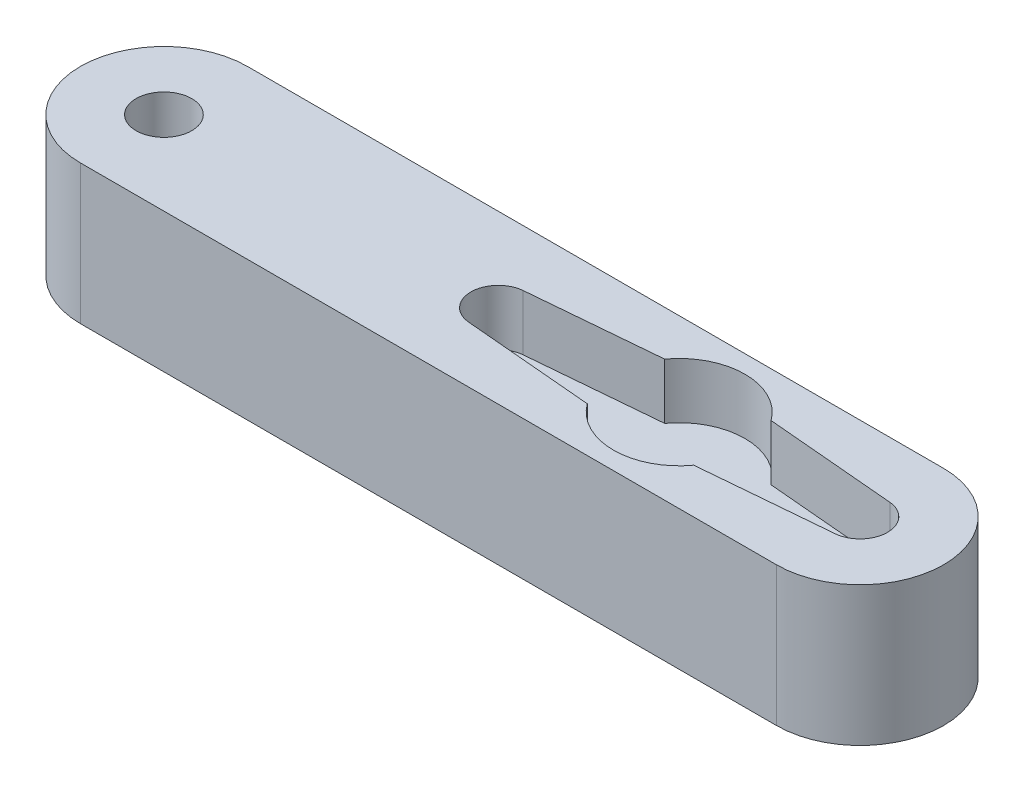
ISO-10303-21;
HEADER;
FILE_DESCRIPTION(('STEP AP214'),'2;1');
FILE_NAME('part.step','',(''),(''),'','','');
FILE_SCHEMA(('AUTOMOTIVE_DESIGN { 1 0 10303 214 1 1 1 1 }'));
ENDSEC;
DATA;
#1=APPLICATION_CONTEXT('core data for automotive mechanical design processes');
#2=APPLICATION_PROTOCOL_DEFINITION('international standard','automotive_design',2000,#1);
#3=PRODUCT_CONTEXT('',#1,'mechanical');
#4=PRODUCT('Part','Part','',(#3));
#5=PRODUCT_RELATED_PRODUCT_CATEGORY('part','',(#4));
#6=PRODUCT_DEFINITION_FORMATION('','',#4);
#7=PRODUCT_DEFINITION_CONTEXT('part definition',#1,'design');
#8=PRODUCT_DEFINITION('design','',#6,#7);
#9=PRODUCT_DEFINITION_SHAPE('','',#8);
#10=(LENGTH_UNIT() NAMED_UNIT(*) SI_UNIT(.MILLI.,.METRE.));
#11=(NAMED_UNIT(*) PLANE_ANGLE_UNIT() SI_UNIT($,.RADIAN.));
#12=(NAMED_UNIT(*) SI_UNIT($,.STERADIAN.) SOLID_ANGLE_UNIT());
#13=UNCERTAINTY_MEASURE_WITH_UNIT(LENGTH_MEASURE(1.E-05),#10,'distance_accuracy_value','');
#14=(GEOMETRIC_REPRESENTATION_CONTEXT(3) GLOBAL_UNCERTAINTY_ASSIGNED_CONTEXT((#13)) GLOBAL_UNIT_ASSIGNED_CONTEXT((#10,
#11,#12)) REPRESENTATION_CONTEXT('',''));
#15=CARTESIAN_POINT('',(0.,0.,0.));
#16=DIRECTION('',(0.,0.,1.));
#17=DIRECTION('',(1.,0.,0.));
#18=AXIS2_PLACEMENT_3D('',#15,#16,#17);
#19=CARTESIAN_POINT('',(-31.75,12.7,0.));
#20=DIRECTION('',(0.,1.,0.));
#21=DIRECTION('',(0.,0.,1.));
#22=AXIS2_PLACEMENT_3D('',#19,#20,#21);
#23=PLANE('',#22);
#24=CARTESIAN_POINT('',(-31.75,12.7,0.));
#25=DIRECTION('',(0.,1.,0.));
#26=DIRECTION('',(0.,0.,1.));
#27=AXIS2_PLACEMENT_3D('',#24,#25,#26);
#28=CIRCLE('',#27,2.54);
#29=CARTESIAN_POINT('',(-31.75,12.7,2.54));
#30=VERTEX_POINT('',#29);
#31=EDGE_CURVE('E159',#30,#30,#28,.T.);
#32=ORIENTED_EDGE('',*,*,#31,.F.);
#33=EDGE_LOOP('',(#32));
#34=FACE_BOUND('',#33,.T.);
#35=CARTESIAN_POINT('',(-31.75,12.7,0.));
#36=DIRECTION('',(0.,1.,0.));
#37=DIRECTION('',(0.,0.,1.));
#38=AXIS2_PLACEMENT_3D('',#35,#36,#37);
#39=CIRCLE('',#38,7.62);
#40=CARTESIAN_POINT('',(-31.75,12.7,-7.62));
#41=VERTEX_POINT('',#40);
#42=CARTESIAN_POINT('',(-31.75,12.7,7.62));
#43=VERTEX_POINT('',#42);
#44=EDGE_CURVE('E172',#41,#43,#39,.T.);
#45=ORIENTED_EDGE('',*,*,#44,.T.);
#46=DIRECTION('',(1.,0.,0.));
#47=VECTOR('',#46,1.);
#48=CARTESIAN_POINT('',(-31.75,12.7,7.62));
#49=LINE('',#48,#47);
#50=CARTESIAN_POINT('',(31.75,12.7,7.62));
#51=VERTEX_POINT('',#50);
#52=EDGE_CURVE('E91',#43,#51,#49,.T.);
#53=ORIENTED_EDGE('',*,*,#52,.T.);
#54=CARTESIAN_POINT('',(31.75,12.7,0.));
#55=DIRECTION('',(0.,1.,0.));
#56=DIRECTION('',(0.,0.,1.));
#57=AXIS2_PLACEMENT_3D('',#54,#55,#56);
#58=CIRCLE('',#57,7.62);
#59=CARTESIAN_POINT('',(31.75,12.7,-7.62));
#60=VERTEX_POINT('',#59);
#61=EDGE_CURVE('E175',#51,#60,#58,.T.);
#62=ORIENTED_EDGE('',*,*,#61,.T.);
#63=DIRECTION('',(-1.,0.,0.));
#64=VECTOR('',#63,1.);
#65=CARTESIAN_POINT('',(-31.75,12.7,-7.62));
#66=LINE('',#65,#64);
#67=EDGE_CURVE('E63',#60,#41,#66,.T.);
#68=ORIENTED_EDGE('',*,*,#67,.T.);
#69=EDGE_LOOP('',(#45,#53,#62,#68));
#70=FACE_BOUND('',#69,.T.);
#71=DIRECTION('',(-0.996194698091746,0.,-0.0871557427476517));
#72=VECTOR('',#71,1.);
#73=CARTESIAN_POINT('',(31.9678893568691,12.7,-2.49048674522936));
#74=LINE('',#73,#72);
#75=CARTESIAN_POINT('',(31.9678893568691,12.7,-2.49048674522936));
#76=VERTEX_POINT('',#75);
#77=CARTESIAN_POINT('',(20.1027652632598,12.7,-3.52855059474841));
#78=VERTEX_POINT('',#77);
#79=EDGE_CURVE('E154',#76,#78,#74,.T.);
#80=ORIENTED_EDGE('',*,*,#79,.F.);
#81=CARTESIAN_POINT('',(31.75,12.7,0.));
#82=DIRECTION('',(0.,-1.,0.));
#83=DIRECTION('',(0.,0.,-1.));
#84=AXIS2_PLACEMENT_3D('',#81,#82,#83);
#85=CIRCLE('',#84,2.5);
#86=CARTESIAN_POINT('',(31.9678893568691,12.7,2.49048674522937));
#87=VERTEX_POINT('',#86);
#88=EDGE_CURVE('E54',#76,#87,#85,.T.);
#89=ORIENTED_EDGE('',*,*,#88,.T.);
#90=DIRECTION('',(-0.996194698091746,0.,0.0871557427476513));
#91=VECTOR('',#90,1.);
#92=CARTESIAN_POINT('',(31.9678893568691,12.7,2.49048674522937));
#93=LINE('',#92,#91);
#94=CARTESIAN_POINT('',(20.1027652632598,12.7,3.52855059474841));
#95=VERTEX_POINT('',#94);
#96=EDGE_CURVE('E158',#87,#95,#93,.T.);
#97=ORIENTED_EDGE('',*,*,#96,.T.);
#98=CARTESIAN_POINT('',(15.25,12.7,0.));
#99=DIRECTION('',(0.,1.,0.));
#100=DIRECTION('',(0.,0.,1.));
#101=AXIS2_PLACEMENT_3D('',#98,#99,#100);
#102=CIRCLE('',#101,6.);
#103=CARTESIAN_POINT('',(10.3972347367402,12.7,3.5285505947484));
#104=VERTEX_POINT('',#103);
#105=EDGE_CURVE('E375',#104,#95,#102,.T.);
#106=ORIENTED_EDGE('',*,*,#105,.F.);
#107=DIRECTION('',(0.996194698091746,0.,0.0871557427476513));
#108=VECTOR('',#107,1.);
#109=CARTESIAN_POINT('',(-1.46788935686914,12.7,2.49048674522937));
#110=LINE('',#109,#108);
#111=CARTESIAN_POINT('',(-1.46788935686914,12.7,2.49048674522937));
#112=VERTEX_POINT('',#111);
#113=EDGE_CURVE('E378',#112,#104,#110,.T.);
#114=ORIENTED_EDGE('',*,*,#113,.F.);
#115=CARTESIAN_POINT('',(-1.25000000000002,12.7,0.));
#116=DIRECTION('',(0.,1.,0.));
#117=DIRECTION('',(0.,0.,1.));
#118=AXIS2_PLACEMENT_3D('',#115,#116,#117);
#119=CIRCLE('',#118,2.5);
#120=CARTESIAN_POINT('',(-1.46788935686914,12.7,-2.49048674522936));
#121=VERTEX_POINT('',#120);
#122=EDGE_CURVE('E360',#121,#112,#119,.T.);
#123=ORIENTED_EDGE('',*,*,#122,.F.);
#124=DIRECTION('',(0.996194698091746,0.,-0.0871557427476517));
#125=VECTOR('',#124,1.);
#126=CARTESIAN_POINT('',(-1.46788935686914,12.7,-2.49048674522936));
#127=LINE('',#126,#125);
#128=CARTESIAN_POINT('',(10.3972347367402,12.7,-3.52855059474841));
#129=VERTEX_POINT('',#128);
#130=EDGE_CURVE('E357',#121,#129,#127,.T.);
#131=ORIENTED_EDGE('',*,*,#130,.T.);
#132=CARTESIAN_POINT('',(15.25,12.7,0.));
#133=DIRECTION('',(0.,1.,0.));
#134=DIRECTION('',(0.,0.,1.));
#135=AXIS2_PLACEMENT_3D('',#132,#133,#134);
#136=CIRCLE('',#135,6.);
#137=EDGE_CURVE('E351',#78,#129,#136,.T.);
#138=ORIENTED_EDGE('',*,*,#137,.F.);
#139=EDGE_LOOP('',(#80,#89,#97,#106,#114,#123,#131,#138));
#140=FACE_BOUND('',#139,.T.);
#141=ADVANCED_FACE('F39',(#34,#70,#140),#23,.T.);
#142=CARTESIAN_POINT('',(-31.75,12.7,0.));
#143=DIRECTION('',(0.,-1.,0.));
#144=DIRECTION('',(0.,0.,-1.));
#145=AXIS2_PLACEMENT_3D('',#142,#143,#144);
#146=CYLINDRICAL_SURFACE('',#145,7.62);
#147=CARTESIAN_POINT('',(-31.75,0.,0.));
#148=DIRECTION('',(0.,1.,0.));
#149=DIRECTION('',(0.,0.,1.));
#150=AXIS2_PLACEMENT_3D('',#147,#148,#149);
#151=CIRCLE('',#150,7.62);
#152=CARTESIAN_POINT('',(-31.75,0.,-7.62));
#153=VERTEX_POINT('',#152);
#154=CARTESIAN_POINT('',(-31.75,0.,7.62));
#155=VERTEX_POINT('',#154);
#156=EDGE_CURVE('E170',#153,#155,#151,.T.);
#157=ORIENTED_EDGE('',*,*,#156,.T.);
#158=DIRECTION('',(0.,-1.,0.));
#159=VECTOR('',#158,1.);
#160=CARTESIAN_POINT('',(-31.75,12.7,7.62));
#161=LINE('',#160,#159);
#162=EDGE_CURVE('E11',#43,#155,#161,.T.);
#163=ORIENTED_EDGE('',*,*,#162,.F.);
#164=ORIENTED_EDGE('',*,*,#44,.F.);
#165=DIRECTION('',(0.,-1.,0.));
#166=VECTOR('',#165,1.);
#167=CARTESIAN_POINT('',(-31.75,12.7,-7.62));
#168=LINE('',#167,#166);
#169=EDGE_CURVE('E178',#41,#153,#168,.T.);
#170=ORIENTED_EDGE('',*,*,#169,.T.);
#171=EDGE_LOOP('',(#157,#163,#164,#170));
#172=FACE_BOUND('',#171,.T.);
#173=ADVANCED_FACE('F41',(#172),#146,.T.);
#174=CARTESIAN_POINT('',(-31.75,12.7,7.62));
#175=DIRECTION('',(0.,0.,-1.));
#176=DIRECTION('',(-1.,0.,0.));
#177=AXIS2_PLACEMENT_3D('',#174,#175,#176);
#178=PLANE('',#177);
#179=DIRECTION('',(1.,0.,0.));
#180=VECTOR('',#179,1.);
#181=CARTESIAN_POINT('',(-31.75,0.,7.62));
#182=LINE('',#181,#180);
#183=CARTESIAN_POINT('',(31.75,0.,7.62));
#184=VERTEX_POINT('',#183);
#185=EDGE_CURVE('E181',#155,#184,#182,.T.);
#186=ORIENTED_EDGE('',*,*,#185,.T.);
#187=DIRECTION('',(0.,-1.,0.));
#188=VECTOR('',#187,1.);
#189=CARTESIAN_POINT('',(31.75,12.7,7.62));
#190=LINE('',#189,#188);
#191=EDGE_CURVE('E47',#51,#184,#190,.T.);
#192=ORIENTED_EDGE('',*,*,#191,.F.);
#193=ORIENTED_EDGE('',*,*,#52,.F.);
#194=ORIENTED_EDGE('',*,*,#162,.T.);
#195=EDGE_LOOP('',(#186,#192,#193,#194));
#196=FACE_BOUND('',#195,.T.);
#197=ADVANCED_FACE('F210',(#196),#178,.F.);
#198=CARTESIAN_POINT('',(31.75,12.7,0.));
#199=DIRECTION('',(0.,-1.,0.));
#200=DIRECTION('',(0.,0.,-1.));
#201=AXIS2_PLACEMENT_3D('',#198,#199,#200);
#202=CYLINDRICAL_SURFACE('',#201,7.62);
#203=CARTESIAN_POINT('',(31.75,0.,0.));
#204=DIRECTION('',(0.,1.,0.));
#205=DIRECTION('',(0.,0.,1.));
#206=AXIS2_PLACEMENT_3D('',#203,#204,#205);
#207=CIRCLE('',#206,7.62);
#208=CARTESIAN_POINT('',(31.75,0.,-7.62));
#209=VERTEX_POINT('',#208);
#210=EDGE_CURVE('E183',#184,#209,#207,.T.);
#211=ORIENTED_EDGE('',*,*,#210,.T.);
#212=DIRECTION('',(0.,-1.,0.));
#213=VECTOR('',#212,1.);
#214=CARTESIAN_POINT('',(31.75,12.7,-7.62));
#215=LINE('',#214,#213);
#216=EDGE_CURVE('E187',#60,#209,#215,.T.);
#217=ORIENTED_EDGE('',*,*,#216,.F.);
#218=ORIENTED_EDGE('',*,*,#61,.F.);
#219=ORIENTED_EDGE('',*,*,#191,.T.);
#220=EDGE_LOOP('',(#211,#217,#218,#219));
#221=FACE_BOUND('',#220,.T.);
#222=ADVANCED_FACE('F192',(#221),#202,.T.);
#223=CARTESIAN_POINT('',(-31.75,12.7,-7.62));
#224=DIRECTION('',(0.,0.,1.));
#225=DIRECTION('',(1.,0.,0.));
#226=AXIS2_PLACEMENT_3D('',#223,#224,#225);
#227=PLANE('',#226);
#228=DIRECTION('',(-1.,0.,0.));
#229=VECTOR('',#228,1.);
#230=CARTESIAN_POINT('',(-31.75,0.,-7.62));
#231=LINE('',#230,#229);
#232=EDGE_CURVE('E84',#209,#153,#231,.T.);
#233=ORIENTED_EDGE('',*,*,#232,.T.);
#234=ORIENTED_EDGE('',*,*,#169,.F.);
#235=ORIENTED_EDGE('',*,*,#67,.F.);
#236=ORIENTED_EDGE('',*,*,#216,.T.);
#237=EDGE_LOOP('',(#233,#234,#235,#236));
#238=FACE_BOUND('',#237,.T.);
#239=ADVANCED_FACE('F200',(#238),#227,.F.);
#240=CARTESIAN_POINT('',(-31.75,0.,0.));
#241=DIRECTION('',(0.,1.,0.));
#242=DIRECTION('',(0.,0.,1.));
#243=AXIS2_PLACEMENT_3D('',#240,#241,#242);
#244=PLANE('',#243);
#245=CARTESIAN_POINT('',(-31.75,0.,0.));
#246=DIRECTION('',(0.,1.,0.));
#247=DIRECTION('',(0.,0.,1.));
#248=AXIS2_PLACEMENT_3D('',#245,#246,#247);
#249=CIRCLE('',#248,2.54);
#250=CARTESIAN_POINT('',(-31.75,0.,2.54));
#251=VERTEX_POINT('',#250);
#252=EDGE_CURVE('E163',#251,#251,#249,.T.);
#253=ORIENTED_EDGE('',*,*,#252,.T.);
#254=EDGE_LOOP('',(#253));
#255=FACE_BOUND('',#254,.T.);
#256=ORIENTED_EDGE('',*,*,#156,.F.);
#257=ORIENTED_EDGE('',*,*,#232,.F.);
#258=ORIENTED_EDGE('',*,*,#210,.F.);
#259=ORIENTED_EDGE('',*,*,#185,.F.);
#260=EDGE_LOOP('',(#256,#257,#258,#259));
#261=FACE_BOUND('',#260,.T.);
#262=ADVANCED_FACE('F196',(#255,#261),#244,.F.);
#263=CARTESIAN_POINT('',(-31.75,0.,0.));
#264=DIRECTION('',(0.,1.,0.));
#265=DIRECTION('',(0.,0.,1.));
#266=AXIS2_PLACEMENT_3D('',#263,#264,#265);
#267=CYLINDRICAL_SURFACE('',#266,2.54);
#268=ORIENTED_EDGE('',*,*,#252,.F.);
#269=EDGE_LOOP('',(#268));
#270=FACE_BOUND('',#269,.T.);
#271=ORIENTED_EDGE('',*,*,#31,.T.);
#272=EDGE_LOOP('',(#271));
#273=FACE_BOUND('',#272,.T.);
#274=ADVANCED_FACE('F207',(#270,#273),#267,.F.);
#275=CARTESIAN_POINT('',(31.75,7.62,0.));
#276=DIRECTION('',(0.,1.,0.));
#277=DIRECTION('',(0.,0.,1.));
#278=AXIS2_PLACEMENT_3D('',#275,#276,#277);
#279=CYLINDRICAL_SURFACE('',#278,2.5);
#280=ORIENTED_EDGE('',*,*,#88,.F.);
#281=DIRECTION('',(0.,1.,0.));
#282=VECTOR('',#281,1.);
#283=CARTESIAN_POINT('',(31.9678893568691,7.62,-2.49048674522936));
#284=LINE('',#283,#282);
#285=CARTESIAN_POINT('',(31.9678893568691,7.62,-2.49048674522936));
#286=VERTEX_POINT('',#285);
#287=EDGE_CURVE('E153',#286,#76,#284,.T.);
#288=ORIENTED_EDGE('',*,*,#287,.F.);
#289=CARTESIAN_POINT('',(31.75,7.62,0.));
#290=DIRECTION('',(0.,-1.,0.));
#291=DIRECTION('',(0.,0.,-1.));
#292=AXIS2_PLACEMENT_3D('',#289,#290,#291);
#293=CIRCLE('',#292,2.5);
#294=CARTESIAN_POINT('',(31.9678893568691,7.62,2.49048674522937));
#295=VERTEX_POINT('',#294);
#296=EDGE_CURVE('E142',#286,#295,#293,.T.);
#297=ORIENTED_EDGE('',*,*,#296,.T.);
#298=DIRECTION('',(0.,1.,0.));
#299=VECTOR('',#298,1.);
#300=CARTESIAN_POINT('',(31.9678893568691,7.62,2.49048674522937));
#301=LINE('',#300,#299);
#302=EDGE_CURVE('E152',#295,#87,#301,.T.);
#303=ORIENTED_EDGE('',*,*,#302,.T.);
#304=EDGE_LOOP('',(#280,#288,#297,#303));
#305=FACE_BOUND('',#304,.T.);
#306=ADVANCED_FACE('F151',(#305),#279,.F.);
#307=CARTESIAN_POINT('',(31.9678893568691,7.62,2.49048674522937));
#308=DIRECTION('',(-0.0871557427476513,0.,-0.996194698091746));
#309=DIRECTION('',(-0.996194698091746,0.,0.0871557427476513));
#310=AXIS2_PLACEMENT_3D('',#307,#308,#309);
#311=PLANE('',#310);
#312=ORIENTED_EDGE('',*,*,#96,.F.);
#313=ORIENTED_EDGE('',*,*,#302,.F.);
#314=DIRECTION('',(-0.996194698091746,0.,0.0871557427476513));
#315=VECTOR('',#314,1.);
#316=CARTESIAN_POINT('',(31.9678893568691,7.62,2.49048674522937));
#317=LINE('',#316,#315);
#318=CARTESIAN_POINT('',(20.1027652632598,7.62,3.52855059474841));
#319=VERTEX_POINT('',#318);
#320=EDGE_CURVE('E138',#295,#319,#317,.T.);
#321=ORIENTED_EDGE('',*,*,#320,.T.);
#322=DIRECTION('',(0.,1.,0.));
#323=VECTOR('',#322,1.);
#324=CARTESIAN_POINT('',(20.1027652632598,7.62,3.52855059474841));
#325=LINE('',#324,#323);
#326=EDGE_CURVE('E160',#319,#95,#325,.T.);
#327=ORIENTED_EDGE('',*,*,#326,.T.);
#328=EDGE_LOOP('',(#312,#313,#321,#327));
#329=FACE_BOUND('',#328,.T.);
#330=ADVANCED_FACE('F156',(#329),#311,.T.);
#331=CARTESIAN_POINT('',(15.25,7.62,0.));
#332=DIRECTION('',(0.,1.,0.));
#333=DIRECTION('',(0.,0.,1.));
#334=AXIS2_PLACEMENT_3D('',#331,#332,#333);
#335=CYLINDRICAL_SURFACE('',#334,6.);
#336=ORIENTED_EDGE('',*,*,#105,.T.);
#337=ORIENTED_EDGE('',*,*,#326,.F.);
#338=CARTESIAN_POINT('',(15.25,7.62,0.));
#339=DIRECTION('',(0.,1.,0.));
#340=DIRECTION('',(0.,0.,1.));
#341=AXIS2_PLACEMENT_3D('',#338,#339,#340);
#342=CIRCLE('',#341,6.);
#343=CARTESIAN_POINT('',(10.3972347367402,7.62,3.5285505947484));
#344=VERTEX_POINT('',#343);
#345=EDGE_CURVE('E146',#344,#319,#342,.T.);
#346=ORIENTED_EDGE('',*,*,#345,.F.);
#347=DIRECTION('',(0.,1.,0.));
#348=VECTOR('',#347,1.);
#349=CARTESIAN_POINT('',(10.3972347367402,7.62,3.5285505947484));
#350=LINE('',#349,#348);
#351=EDGE_CURVE('E165',#344,#104,#350,.T.);
#352=ORIENTED_EDGE('',*,*,#351,.T.);
#353=EDGE_LOOP('',(#336,#337,#346,#352));
#354=FACE_BOUND('',#353,.T.);
#355=ADVANCED_FACE('F227',(#354),#335,.F.);
#356=CARTESIAN_POINT('',(-1.46788935686914,7.62,2.49048674522937));
#357=DIRECTION('',(-0.0871557427476513,0.,0.996194698091746));
#358=DIRECTION('',(0.996194698091746,0.,0.0871557427476513));
#359=AXIS2_PLACEMENT_3D('',#356,#357,#358);
#360=PLANE('',#359);
#361=ORIENTED_EDGE('',*,*,#113,.T.);
#362=ORIENTED_EDGE('',*,*,#351,.F.);
#363=DIRECTION('',(0.996194698091746,0.,0.0871557427476513));
#364=VECTOR('',#363,1.);
#365=CARTESIAN_POINT('',(-1.46788935686914,7.62,2.49048674522937));
#366=LINE('',#365,#364);
#367=CARTESIAN_POINT('',(-1.46788935686914,7.62,2.49048674522937));
#368=VERTEX_POINT('',#367);
#369=EDGE_CURVE('E396',#368,#344,#366,.T.);
#370=ORIENTED_EDGE('',*,*,#369,.F.);
#371=DIRECTION('',(0.,1.,0.));
#372=VECTOR('',#371,1.);
#373=CARTESIAN_POINT('',(-1.46788935686914,7.62,2.49048674522937));
#374=LINE('',#373,#372);
#375=EDGE_CURVE('E371',#368,#112,#374,.T.);
#376=ORIENTED_EDGE('',*,*,#375,.T.);
#377=EDGE_LOOP('',(#361,#362,#370,#376));
#378=FACE_BOUND('',#377,.T.);
#379=ADVANCED_FACE('F230',(#378),#360,.F.);
#380=CARTESIAN_POINT('',(-1.25000000000002,7.62,0.));
#381=DIRECTION('',(0.,1.,0.));
#382=DIRECTION('',(0.,0.,1.));
#383=AXIS2_PLACEMENT_3D('',#380,#381,#382);
#384=CYLINDRICAL_SURFACE('',#383,2.5);
#385=ORIENTED_EDGE('',*,*,#122,.T.);
#386=ORIENTED_EDGE('',*,*,#375,.F.);
#387=CARTESIAN_POINT('',(-1.25000000000002,7.62,0.));
#388=DIRECTION('',(0.,1.,0.));
#389=DIRECTION('',(0.,0.,1.));
#390=AXIS2_PLACEMENT_3D('',#387,#388,#389);
#391=CIRCLE('',#390,2.5);
#392=CARTESIAN_POINT('',(-1.46788935686914,7.62,-2.49048674522936));
#393=VERTEX_POINT('',#392);
#394=EDGE_CURVE('E386',#393,#368,#391,.T.);
#395=ORIENTED_EDGE('',*,*,#394,.F.);
#396=DIRECTION('',(0.,1.,0.));
#397=VECTOR('',#396,1.);
#398=CARTESIAN_POINT('',(-1.46788935686914,7.62,-2.49048674522936));
#399=LINE('',#398,#397);
#400=EDGE_CURVE('E369',#393,#121,#399,.T.);
#401=ORIENTED_EDGE('',*,*,#400,.T.);
#402=EDGE_LOOP('',(#385,#386,#395,#401));
#403=FACE_BOUND('',#402,.T.);
#404=ADVANCED_FACE('F234',(#403),#384,.F.);
#405=CARTESIAN_POINT('',(-1.46788935686914,7.62,-2.49048674522936));
#406=DIRECTION('',(0.0871557427476517,0.,0.996194698091746));
#407=DIRECTION('',(0.996194698091746,0.,-0.0871557427476517));
#408=AXIS2_PLACEMENT_3D('',#405,#406,#407);
#409=PLANE('',#408);
#410=ORIENTED_EDGE('',*,*,#130,.F.);
#411=ORIENTED_EDGE('',*,*,#400,.F.);
#412=DIRECTION('',(0.996194698091746,0.,-0.0871557427476517));
#413=VECTOR('',#412,1.);
#414=CARTESIAN_POINT('',(-1.46788935686914,7.62,-2.49048674522936));
#415=LINE('',#414,#413);
#416=CARTESIAN_POINT('',(10.3972347367402,7.62,-3.52855059474841));
#417=VERTEX_POINT('',#416);
#418=EDGE_CURVE('E388',#393,#417,#415,.T.);
#419=ORIENTED_EDGE('',*,*,#418,.T.);
#420=DIRECTION('',(0.,1.,0.));
#421=VECTOR('',#420,1.);
#422=CARTESIAN_POINT('',(10.3972347367402,7.62,-3.52855059474841));
#423=LINE('',#422,#421);
#424=EDGE_CURVE('E367',#417,#129,#423,.T.);
#425=ORIENTED_EDGE('',*,*,#424,.T.);
#426=EDGE_LOOP('',(#410,#411,#419,#425));
#427=FACE_BOUND('',#426,.T.);
#428=ADVANCED_FACE('F238',(#427),#409,.T.);
#429=CARTESIAN_POINT('',(15.25,7.62,0.));
#430=DIRECTION('',(0.,1.,0.));
#431=DIRECTION('',(0.,0.,1.));
#432=AXIS2_PLACEMENT_3D('',#429,#430,#431);
#433=CYLINDRICAL_SURFACE('',#432,6.);
#434=ORIENTED_EDGE('',*,*,#137,.T.);
#435=ORIENTED_EDGE('',*,*,#424,.F.);
#436=CARTESIAN_POINT('',(15.25,7.62,0.));
#437=DIRECTION('',(0.,1.,0.));
#438=DIRECTION('',(0.,0.,1.));
#439=AXIS2_PLACEMENT_3D('',#436,#437,#438);
#440=CIRCLE('',#439,6.);
#441=CARTESIAN_POINT('',(20.1027652632598,7.62,-3.52855059474841));
#442=VERTEX_POINT('',#441);
#443=EDGE_CURVE('E390',#442,#417,#440,.T.);
#444=ORIENTED_EDGE('',*,*,#443,.F.);
#445=DIRECTION('',(0.,1.,0.));
#446=VECTOR('',#445,1.);
#447=CARTESIAN_POINT('',(20.1027652632598,7.62,-3.52855059474841));
#448=LINE('',#447,#446);
#449=EDGE_CURVE('E348',#442,#78,#448,.T.);
#450=ORIENTED_EDGE('',*,*,#449,.T.);
#451=EDGE_LOOP('',(#434,#435,#444,#450));
#452=FACE_BOUND('',#451,.T.);
#453=ADVANCED_FACE('F242',(#452),#433,.F.);
#454=CARTESIAN_POINT('',(31.9678893568691,7.62,-2.49048674522936));
#455=DIRECTION('',(0.0871557427476517,0.,-0.996194698091746));
#456=DIRECTION('',(-0.996194698091746,0.,-0.0871557427476517));
#457=AXIS2_PLACEMENT_3D('',#454,#455,#456);
#458=PLANE('',#457);
#459=ORIENTED_EDGE('',*,*,#79,.T.);
#460=ORIENTED_EDGE('',*,*,#449,.F.);
#461=DIRECTION('',(-0.996194698091746,0.,-0.0871557427476517));
#462=VECTOR('',#461,1.);
#463=CARTESIAN_POINT('',(31.9678893568691,7.62,-2.49048674522936));
#464=LINE('',#463,#462);
#465=EDGE_CURVE('E365',#286,#442,#464,.T.);
#466=ORIENTED_EDGE('',*,*,#465,.F.);
#467=ORIENTED_EDGE('',*,*,#287,.T.);
#468=EDGE_LOOP('',(#459,#460,#466,#467));
#469=FACE_BOUND('',#468,.T.);
#470=ADVANCED_FACE('F246',(#469),#458,.F.);
#471=CARTESIAN_POINT('',(31.75,7.62,0.));
#472=DIRECTION('',(0.,-1.,0.));
#473=DIRECTION('',(0.,0.,-1.));
#474=AXIS2_PLACEMENT_3D('',#471,#472,#473);
#475=PLANE('',#474);
#476=ORIENTED_EDGE('',*,*,#296,.F.);
#477=ORIENTED_EDGE('',*,*,#465,.T.);
#478=ORIENTED_EDGE('',*,*,#443,.T.);
#479=ORIENTED_EDGE('',*,*,#418,.F.);
#480=ORIENTED_EDGE('',*,*,#394,.T.);
#481=ORIENTED_EDGE('',*,*,#369,.T.);
#482=ORIENTED_EDGE('',*,*,#345,.T.);
#483=ORIENTED_EDGE('',*,*,#320,.F.);
#484=EDGE_LOOP('',(#476,#477,#478,#479,#480,#481,#482,#483));
#485=FACE_BOUND('',#484,.T.);
#486=ADVANCED_FACE('F140',(#485),#475,.F.);
#487=CLOSED_SHELL('',(#141,#173,#197,#222,#239,#262,#274,#306,#330,#355,#379,#404,#428,#453,
#470,#486));
#488=MANIFOLD_SOLID_BREP('B2',#487);
#489=ADVANCED_BREP_SHAPE_REPRESENTATION('',(#18,#488),#14);
#490=SHAPE_DEFINITION_REPRESENTATION(#9,#489);
ENDSEC;
END-ISO-10303-21;
